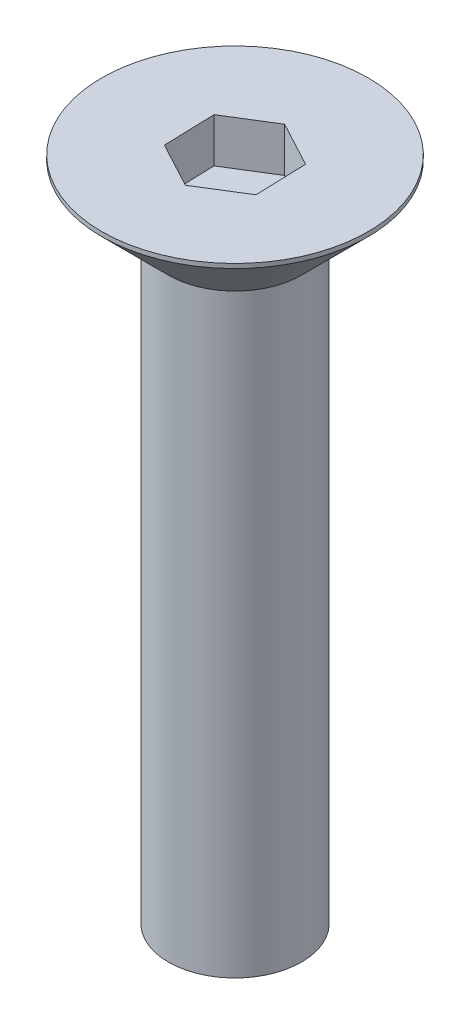
ISO-10303-21;
HEADER;
FILE_DESCRIPTION(('STEP AP214'),'2;1');
FILE_NAME('part.step','',(''),(''),'','','');
FILE_SCHEMA(('AUTOMOTIVE_DESIGN { 1 0 10303 214 1 1 1 1 }'));
ENDSEC;
DATA;
#1=APPLICATION_CONTEXT('core data for automotive mechanical design processes');
#2=APPLICATION_PROTOCOL_DEFINITION('international standard','automotive_design',2000,#1);
#3=PRODUCT_CONTEXT('',#1,'mechanical');
#4=PRODUCT('Part','Part','',(#3));
#5=PRODUCT_RELATED_PRODUCT_CATEGORY('part','',(#4));
#6=PRODUCT_DEFINITION_FORMATION('','',#4);
#7=PRODUCT_DEFINITION_CONTEXT('part definition',#1,'design');
#8=PRODUCT_DEFINITION('design','',#6,#7);
#9=PRODUCT_DEFINITION_SHAPE('','',#8);
#10=(LENGTH_UNIT() NAMED_UNIT(*) SI_UNIT(.MILLI.,.METRE.));
#11=(NAMED_UNIT(*) PLANE_ANGLE_UNIT() SI_UNIT($,.RADIAN.));
#12=(NAMED_UNIT(*) SI_UNIT($,.STERADIAN.) SOLID_ANGLE_UNIT());
#13=UNCERTAINTY_MEASURE_WITH_UNIT(LENGTH_MEASURE(1.E-05),#10,'distance_accuracy_value','');
#14=(GEOMETRIC_REPRESENTATION_CONTEXT(3) GLOBAL_UNCERTAINTY_ASSIGNED_CONTEXT((#13)) GLOBAL_UNIT_ASSIGNED_CONTEXT((#10,
#11,#12)) REPRESENTATION_CONTEXT('',''));
#15=CARTESIAN_POINT('',(0.,0.,0.));
#16=DIRECTION('',(0.,0.,1.));
#17=DIRECTION('',(1.,0.,0.));
#18=AXIS2_PLACEMENT_3D('',#15,#16,#17);
#19=CARTESIAN_POINT('',(0.,12.,0.));
#20=DIRECTION('',(0.,-1.,0.));
#21=DIRECTION('',(0.,0.,-1.));
#22=AXIS2_PLACEMENT_3D('',#19,#20,#21);
#23=CYLINDRICAL_SURFACE('',#22,1.5);
#24=CARTESIAN_POINT('',(0.,13.4,0.));
#25=DIRECTION('',(0.,1.,0.));
#26=DIRECTION('',(0.,0.,1.));
#27=AXIS2_PLACEMENT_3D('',#24,#25,#26);
#28=CIRCLE('',#27,1.5);
#29=CARTESIAN_POINT('',(0.,13.4,1.5));
#30=VERTEX_POINT('',#29);
#31=EDGE_CURVE('E11',#30,#30,#28,.F.);
#32=ORIENTED_EDGE('',*,*,#31,.T.);
#33=EDGE_LOOP('',(#32));
#34=FACE_BOUND('',#33,.T.);
#35=CARTESIAN_POINT('',(0.,0.,0.));
#36=DIRECTION('',(0.,1.,0.));
#37=DIRECTION('',(0.,0.,1.));
#38=AXIS2_PLACEMENT_3D('',#35,#36,#37);
#39=CIRCLE('',#38,1.5);
#40=CARTESIAN_POINT('',(0.,0.,1.5));
#41=VERTEX_POINT('',#40);
#42=EDGE_CURVE('E167',#41,#41,#39,.T.);
#43=ORIENTED_EDGE('',*,*,#42,.T.);
#44=EDGE_LOOP('',(#43));
#45=FACE_BOUND('',#44,.T.);
#46=ADVANCED_FACE('F39',(#34,#45),#23,.T.);
#47=CARTESIAN_POINT('',(0.,0.,0.));
#48=DIRECTION('',(0.,1.,0.));
#49=DIRECTION('',(0.,0.,1.));
#50=AXIS2_PLACEMENT_3D('',#47,#48,#49);
#51=PLANE('',#50);
#52=ORIENTED_EDGE('',*,*,#42,.F.);
#53=EDGE_LOOP('',(#52));
#54=FACE_BOUND('',#53,.T.);
#55=ADVANCED_FACE('F191',(#54),#51,.F.);
#56=CARTESIAN_POINT('',(0.,15.,0.));
#57=DIRECTION('',(0.,-1.,0.));
#58=DIRECTION('',(0.,0.,-1.));
#59=AXIS2_PLACEMENT_3D('',#56,#57,#58);
#60=CYLINDRICAL_SURFACE('',#59,3.);
#61=CARTESIAN_POINT('',(0.,14.9,0.));
#62=DIRECTION('',(0.,1.,0.));
#63=DIRECTION('',(0.,0.,1.));
#64=AXIS2_PLACEMENT_3D('',#61,#62,#63);
#65=CIRCLE('',#64,3.);
#66=CARTESIAN_POINT('',(0.,14.9,3.));
#67=VERTEX_POINT('',#66);
#68=EDGE_CURVE('E48',#67,#67,#65,.T.);
#69=ORIENTED_EDGE('',*,*,#68,.T.);
#70=EDGE_LOOP('',(#69));
#71=FACE_BOUND('',#70,.T.);
#72=CARTESIAN_POINT('',(0.,15.,0.));
#73=DIRECTION('',(0.,1.,0.));
#74=DIRECTION('',(0.,0.,1.));
#75=AXIS2_PLACEMENT_3D('',#72,#73,#74);
#76=CIRCLE('',#75,3.);
#77=CARTESIAN_POINT('',(0.,15.,3.));
#78=VERTEX_POINT('',#77);
#79=EDGE_CURVE('E154',#78,#78,#76,.T.);
#80=ORIENTED_EDGE('',*,*,#79,.F.);
#81=EDGE_LOOP('',(#80));
#82=FACE_BOUND('',#81,.T.);
#83=ADVANCED_FACE('F174',(#71,#82),#60,.T.);
#84=CARTESIAN_POINT('',(0.,15.,0.));
#85=DIRECTION('',(0.,1.,0.));
#86=DIRECTION('',(0.,0.,1.));
#87=AXIS2_PLACEMENT_3D('',#84,#85,#86);
#88=PLANE('',#87);
#89=DIRECTION('',(0.850000320742484,0.,-0.526782170102287));
#90=VECTOR('',#89,1.);
#91=CARTESIAN_POINT('',(0.0360342561103451,15.,1.15413814845533));
#92=LINE('',#91,#90);
#93=CARTESIAN_POINT('',(0.0360342561103451,15.,1.15413814845533));
#94=VERTEX_POINT('',#93);
#95=CARTESIAN_POINT('',(1.01753008409423,15.,0.545862493029633));
#96=VERTEX_POINT('',#95);
#97=EDGE_CURVE('E55',#94,#96,#92,.T.);
#98=ORIENTED_EDGE('',*,*,#97,.F.);
#99=DIRECTION('',(0.881206901940518,0.,0.472730785936769));
#100=VECTOR('',#99,1.);
#101=CARTESIAN_POINT('',(-0.981495827983883,15.,0.608275655425701));
#102=LINE('',#101,#100);
#103=CARTESIAN_POINT('',(-0.981495827983883,15.,0.608275655425701));
#104=VERTEX_POINT('',#103);
#105=EDGE_CURVE('E148',#104,#94,#102,.T.);
#106=ORIENTED_EDGE('',*,*,#105,.F.);
#107=DIRECTION('',(0.0312065811980338,0.,0.999512956039055));
#108=VECTOR('',#107,1.);
#109=CARTESIAN_POINT('',(-1.01753008409423,15.,-0.545862493029634));
#110=LINE('',#109,#108);
#111=CARTESIAN_POINT('',(-1.01753008409423,15.,-0.545862493029634));
#112=VERTEX_POINT('',#111);
#113=EDGE_CURVE('E145',#112,#104,#110,.T.);
#114=ORIENTED_EDGE('',*,*,#113,.F.);
#115=DIRECTION('',(-0.850000320742484,0.,0.526782170102287));
#116=VECTOR('',#115,1.);
#117=CARTESIAN_POINT('',(-0.0360342561103455,15.,-1.15413814845534));
#118=LINE('',#117,#116);
#119=CARTESIAN_POINT('',(-0.0360342561103455,15.,-1.15413814845534));
#120=VERTEX_POINT('',#119);
#121=EDGE_CURVE('E103',#120,#112,#118,.T.);
#122=ORIENTED_EDGE('',*,*,#121,.F.);
#123=DIRECTION('',(-0.881206901940518,0.,-0.472730785936769));
#124=VECTOR('',#123,1.);
#125=CARTESIAN_POINT('',(0.981495827983882,15.,-0.608275655425702));
#126=LINE('',#125,#124);
#127=CARTESIAN_POINT('',(0.981495827983882,15.,-0.608275655425702));
#128=VERTEX_POINT('',#127);
#129=EDGE_CURVE('E139',#128,#120,#126,.T.);
#130=ORIENTED_EDGE('',*,*,#129,.F.);
#131=DIRECTION('',(-0.0312065811980342,0.,-0.999512956039055));
#132=VECTOR('',#131,1.);
#133=CARTESIAN_POINT('',(1.01753008409423,15.,0.545862493029633));
#134=LINE('',#133,#132);
#135=EDGE_CURVE('E135',#96,#128,#134,.T.);
#136=ORIENTED_EDGE('',*,*,#135,.F.);
#137=EDGE_LOOP('',(#98,#106,#114,#122,#130,#136));
#138=FACE_BOUND('',#137,.T.);
#139=ORIENTED_EDGE('',*,*,#79,.T.);
#140=EDGE_LOOP('',(#139));
#141=FACE_BOUND('',#140,.T.);
#142=ADVANCED_FACE('F179',(#138,#141),#88,.T.);
#143=CARTESIAN_POINT('',(0.,14.9,0.));
#144=DIRECTION('',(0.,1.,0.));
#145=DIRECTION('',(0.,0.,1.));
#146=AXIS2_PLACEMENT_3D('',#143,#144,#145);
#147=CONICAL_SURFACE('',#146,3.,0.785398163397453);
#148=ORIENTED_EDGE('',*,*,#31,.F.);
#149=EDGE_LOOP('',(#148));
#150=FACE_BOUND('',#149,.T.);
#151=ORIENTED_EDGE('',*,*,#68,.F.);
#152=EDGE_LOOP('',(#151));
#153=FACE_BOUND('',#152,.T.);
#154=ADVANCED_FACE('F41',(#150,#153),#147,.T.);
#155=CARTESIAN_POINT('',(0.0360342561103451,14.,1.15413814845533));
#156=DIRECTION('',(0.526782170102287,0.,0.850000320742484));
#157=DIRECTION('',(0.850000320742484,0.,-0.526782170102287));
#158=AXIS2_PLACEMENT_3D('',#155,#156,#157);
#159=PLANE('',#158);
#160=ORIENTED_EDGE('',*,*,#97,.T.);
#161=DIRECTION('',(0.,1.,0.));
#162=VECTOR('',#161,1.);
#163=CARTESIAN_POINT('',(1.01753008409423,14.,0.545862493029633));
#164=LINE('',#163,#162);
#165=CARTESIAN_POINT('',(1.01753008409423,14.,0.545862493029633));
#166=VERTEX_POINT('',#165);
#167=EDGE_CURVE('E85',#166,#96,#164,.T.);
#168=ORIENTED_EDGE('',*,*,#167,.F.);
#169=DIRECTION('',(0.850000320742484,0.,-0.526782170102287));
#170=VECTOR('',#169,1.);
#171=CARTESIAN_POINT('',(0.0360342561103451,14.,1.15413814845533));
#172=LINE('',#171,#170);
#173=CARTESIAN_POINT('',(0.0360342561103451,14.,1.15413814845533));
#174=VERTEX_POINT('',#173);
#175=EDGE_CURVE('E151',#174,#166,#172,.T.);
#176=ORIENTED_EDGE('',*,*,#175,.F.);
#177=DIRECTION('',(0.,1.,0.));
#178=VECTOR('',#177,1.);
#179=CARTESIAN_POINT('',(0.0360342561103451,14.,1.15413814845533));
#180=LINE('',#179,#178);
#181=EDGE_CURVE('E63',#174,#94,#180,.T.);
#182=ORIENTED_EDGE('',*,*,#181,.T.);
#183=EDGE_LOOP('',(#160,#168,#176,#182));
#184=FACE_BOUND('',#183,.T.);
#185=ADVANCED_FACE('F178',(#184),#159,.F.);
#186=CARTESIAN_POINT('',(-0.981495827983883,14.,0.608275655425701));
#187=DIRECTION('',(-0.472730785936769,0.,0.881206901940518));
#188=DIRECTION('',(0.881206901940518,0.,0.472730785936769));
#189=AXIS2_PLACEMENT_3D('',#186,#187,#188);
#190=PLANE('',#189);
#191=ORIENTED_EDGE('',*,*,#105,.T.);
#192=ORIENTED_EDGE('',*,*,#181,.F.);
#193=DIRECTION('',(0.881206901940518,0.,0.472730785936769));
#194=VECTOR('',#193,1.);
#195=CARTESIAN_POINT('',(-0.981495827983883,14.,0.608275655425701));
#196=LINE('',#195,#194);
#197=CARTESIAN_POINT('',(-0.981495827983883,14.,0.608275655425701));
#198=VERTEX_POINT('',#197);
#199=EDGE_CURVE('E117',#198,#174,#196,.T.);
#200=ORIENTED_EDGE('',*,*,#199,.F.);
#201=DIRECTION('',(0.,1.,0.));
#202=VECTOR('',#201,1.);
#203=CARTESIAN_POINT('',(-0.981495827983883,14.,0.608275655425701));
#204=LINE('',#203,#202);
#205=EDGE_CURVE('E108',#198,#104,#204,.T.);
#206=ORIENTED_EDGE('',*,*,#205,.T.);
#207=EDGE_LOOP('',(#191,#192,#200,#206));
#208=FACE_BOUND('',#207,.T.);
#209=ADVANCED_FACE('F185',(#208),#190,.F.);
#210=CARTESIAN_POINT('',(-1.01753008409423,14.,-0.545862493029634));
#211=DIRECTION('',(-0.999512956039055,0.,0.0312065811980338));
#212=DIRECTION('',(0.0312065811980338,0.,0.999512956039055));
#213=AXIS2_PLACEMENT_3D('',#210,#211,#212);
#214=PLANE('',#213);
#215=ORIENTED_EDGE('',*,*,#113,.T.);
#216=ORIENTED_EDGE('',*,*,#205,.F.);
#217=DIRECTION('',(0.0312065811980338,0.,0.999512956039055));
#218=VECTOR('',#217,1.);
#219=CARTESIAN_POINT('',(-1.01753008409423,14.,-0.545862493029634));
#220=LINE('',#219,#218);
#221=CARTESIAN_POINT('',(-1.01753008409423,14.,-0.545862493029634));
#222=VERTEX_POINT('',#221);
#223=EDGE_CURVE('E112',#222,#198,#220,.T.);
#224=ORIENTED_EDGE('',*,*,#223,.F.);
#225=DIRECTION('',(0.,1.,0.));
#226=VECTOR('',#225,1.);
#227=CARTESIAN_POINT('',(-1.01753008409423,14.,-0.545862493029634));
#228=LINE('',#227,#226);
#229=EDGE_CURVE('E96',#222,#112,#228,.T.);
#230=ORIENTED_EDGE('',*,*,#229,.T.);
#231=EDGE_LOOP('',(#215,#216,#224,#230));
#232=FACE_BOUND('',#231,.T.);
#233=ADVANCED_FACE('F113',(#232),#214,.F.);
#234=CARTESIAN_POINT('',(-0.0360342561103455,14.,-1.15413814845534));
#235=DIRECTION('',(-0.526782170102287,0.,-0.850000320742484));
#236=DIRECTION('',(-0.850000320742484,0.,0.526782170102287));
#237=AXIS2_PLACEMENT_3D('',#234,#235,#236);
#238=PLANE('',#237);
#239=ORIENTED_EDGE('',*,*,#121,.T.);
#240=ORIENTED_EDGE('',*,*,#229,.F.);
#241=DIRECTION('',(-0.850000320742484,0.,0.526782170102287));
#242=VECTOR('',#241,1.);
#243=CARTESIAN_POINT('',(-0.0360342561103455,14.,-1.15413814845534));
#244=LINE('',#243,#242);
#245=CARTESIAN_POINT('',(-0.0360342561103455,14.,-1.15413814845534));
#246=VERTEX_POINT('',#245);
#247=EDGE_CURVE('E100',#246,#222,#244,.T.);
#248=ORIENTED_EDGE('',*,*,#247,.F.);
#249=DIRECTION('',(0.,1.,0.));
#250=VECTOR('',#249,1.);
#251=CARTESIAN_POINT('',(-0.0360342561103455,14.,-1.15413814845534));
#252=LINE('',#251,#250);
#253=EDGE_CURVE('E109',#246,#120,#252,.T.);
#254=ORIENTED_EDGE('',*,*,#253,.T.);
#255=EDGE_LOOP('',(#239,#240,#248,#254));
#256=FACE_BOUND('',#255,.T.);
#257=ADVANCED_FACE('F98',(#256),#238,.F.);
#258=CARTESIAN_POINT('',(0.981495827983882,14.,-0.608275655425702));
#259=DIRECTION('',(0.472730785936769,0.,-0.881206901940518));
#260=DIRECTION('',(-0.881206901940518,0.,-0.472730785936769));
#261=AXIS2_PLACEMENT_3D('',#258,#259,#260);
#262=PLANE('',#261);
#263=ORIENTED_EDGE('',*,*,#129,.T.);
#264=ORIENTED_EDGE('',*,*,#253,.F.);
#265=DIRECTION('',(-0.881206901940518,0.,-0.472730785936769));
#266=VECTOR('',#265,1.);
#267=CARTESIAN_POINT('',(0.981495827983882,14.,-0.608275655425702));
#268=LINE('',#267,#266);
#269=CARTESIAN_POINT('',(0.981495827983882,14.,-0.608275655425702));
#270=VERTEX_POINT('',#269);
#271=EDGE_CURVE('E123',#270,#246,#268,.T.);
#272=ORIENTED_EDGE('',*,*,#271,.F.);
#273=DIRECTION('',(0.,1.,0.));
#274=VECTOR('',#273,1.);
#275=CARTESIAN_POINT('',(0.981495827983882,14.,-0.608275655425702));
#276=LINE('',#275,#274);
#277=EDGE_CURVE('E159',#270,#128,#276,.T.);
#278=ORIENTED_EDGE('',*,*,#277,.T.);
#279=EDGE_LOOP('',(#263,#264,#272,#278));
#280=FACE_BOUND('',#279,.T.);
#281=ADVANCED_FACE('F205',(#280),#262,.F.);
#282=CARTESIAN_POINT('',(1.01753008409423,14.,0.545862493029633));
#283=DIRECTION('',(0.999512956039055,0.,-0.0312065811980342));
#284=DIRECTION('',(-0.0312065811980342,0.,-0.999512956039055));
#285=AXIS2_PLACEMENT_3D('',#282,#283,#284);
#286=PLANE('',#285);
#287=ORIENTED_EDGE('',*,*,#135,.T.);
#288=ORIENTED_EDGE('',*,*,#277,.F.);
#289=DIRECTION('',(-0.0312065811980342,0.,-0.999512956039055));
#290=VECTOR('',#289,1.);
#291=CARTESIAN_POINT('',(1.01753008409423,14.,0.545862493029633));
#292=LINE('',#291,#290);
#293=EDGE_CURVE('E127',#166,#270,#292,.T.);
#294=ORIENTED_EDGE('',*,*,#293,.F.);
#295=ORIENTED_EDGE('',*,*,#167,.T.);
#296=EDGE_LOOP('',(#287,#288,#294,#295));
#297=FACE_BOUND('',#296,.T.);
#298=ADVANCED_FACE('F202',(#297),#286,.F.);
#299=CARTESIAN_POINT('',(0.,14.,0.));
#300=DIRECTION('',(0.,1.,0.));
#301=DIRECTION('',(0.,0.,1.));
#302=AXIS2_PLACEMENT_3D('',#299,#300,#301);
#303=PLANE('',#302);
#304=ORIENTED_EDGE('',*,*,#175,.T.);
#305=ORIENTED_EDGE('',*,*,#293,.T.);
#306=ORIENTED_EDGE('',*,*,#271,.T.);
#307=ORIENTED_EDGE('',*,*,#247,.T.);
#308=ORIENTED_EDGE('',*,*,#223,.T.);
#309=ORIENTED_EDGE('',*,*,#199,.T.);
#310=EDGE_LOOP('',(#304,#305,#306,#307,#308,#309));
#311=FACE_BOUND('',#310,.T.);
#312=ADVANCED_FACE('F120',(#311),#303,.T.);
#313=CLOSED_SHELL('',(#46,#55,#83,#142,#154,#185,#209,#233,#257,#281,#298,#312));
#314=MANIFOLD_SOLID_BREP('B2',#313);
#315=ADVANCED_BREP_SHAPE_REPRESENTATION('',(#18,#314),#14);
#316=SHAPE_DEFINITION_REPRESENTATION(#9,#315);
ENDSEC;
END-ISO-10303-21;
